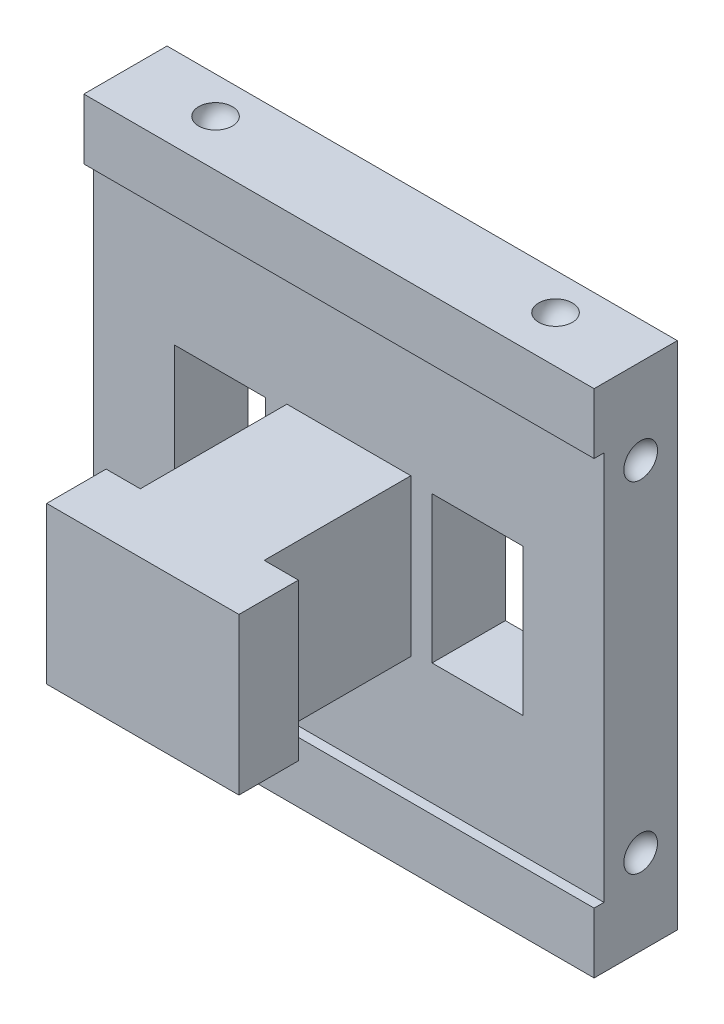
ISO-10303-21;
HEADER;
FILE_DESCRIPTION(('STEP AP214'),'2;1');
FILE_NAME('part.step','',(''),(''),'','','');
FILE_SCHEMA(('AUTOMOTIVE_DESIGN { 1 0 10303 214 1 1 1 1 }'));
ENDSEC;
DATA;
#1=APPLICATION_CONTEXT('core data for automotive mechanical design processes');
#2=APPLICATION_PROTOCOL_DEFINITION('international standard','automotive_design',2000,#1);
#3=PRODUCT_CONTEXT('',#1,'mechanical');
#4=PRODUCT('Part','Part','',(#3));
#5=PRODUCT_RELATED_PRODUCT_CATEGORY('part','',(#4));
#6=PRODUCT_DEFINITION_FORMATION('','',#4);
#7=PRODUCT_DEFINITION_CONTEXT('part definition',#1,'design');
#8=PRODUCT_DEFINITION('design','',#6,#7);
#9=PRODUCT_DEFINITION_SHAPE('','',#8);
#10=(LENGTH_UNIT() NAMED_UNIT(*) SI_UNIT(.MILLI.,.METRE.));
#11=(NAMED_UNIT(*) PLANE_ANGLE_UNIT() SI_UNIT($,.RADIAN.));
#12=(NAMED_UNIT(*) SI_UNIT($,.STERADIAN.) SOLID_ANGLE_UNIT());
#13=UNCERTAINTY_MEASURE_WITH_UNIT(LENGTH_MEASURE(1.E-05),#10,'distance_accuracy_value','');
#14=(GEOMETRIC_REPRESENTATION_CONTEXT(3) GLOBAL_UNCERTAINTY_ASSIGNED_CONTEXT((#13)) GLOBAL_UNIT_ASSIGNED_CONTEXT((#10,
#11,#12)) REPRESENTATION_CONTEXT('',''));
#15=CARTESIAN_POINT('',(0.,0.,0.));
#16=DIRECTION('',(0.,0.,1.));
#17=DIRECTION('',(1.,0.,0.));
#18=AXIS2_PLACEMENT_3D('',#15,#16,#17);
#19=CARTESIAN_POINT('',(0.,0.,3.7));
#20=DIRECTION('',(0.,0.,-1.));
#21=DIRECTION('',(-1.,0.,0.));
#22=AXIS2_PLACEMENT_3D('',#19,#20,#21);
#23=PLANE('',#22);
#24=DIRECTION('',(0.,-1.,0.));
#25=VECTOR('',#24,1.);
#26=CARTESIAN_POINT('',(17.075,15.525,3.7));
#27=LINE('',#26,#25);
#28=CARTESIAN_POINT('',(17.075,15.525,3.7));
#29=VERTEX_POINT('',#28);
#30=CARTESIAN_POINT('',(17.075,8.125,3.7));
#31=VERTEX_POINT('',#30);
#32=EDGE_CURVE('E380',#29,#31,#27,.T.);
#33=ORIENTED_EDGE('',*,*,#32,.F.);
#34=DIRECTION('',(-1.,0.,0.));
#35=VECTOR('',#34,1.);
#36=CARTESIAN_POINT('',(21.675,15.525,3.7));
#37=LINE('',#36,#35);
#38=CARTESIAN_POINT('',(21.675,15.525,3.7));
#39=VERTEX_POINT('',#38);
#40=EDGE_CURVE('E378',#39,#29,#37,.T.);
#41=ORIENTED_EDGE('',*,*,#40,.F.);
#42=DIRECTION('',(0.,1.,0.));
#43=VECTOR('',#42,1.);
#44=CARTESIAN_POINT('',(21.675,15.525,3.7));
#45=LINE('',#44,#43);
#46=CARTESIAN_POINT('',(21.675,8.125,3.7));
#47=VERTEX_POINT('',#46);
#48=EDGE_CURVE('E386',#47,#39,#45,.T.);
#49=ORIENTED_EDGE('',*,*,#48,.F.);
#50=DIRECTION('',(1.,0.,0.));
#51=VECTOR('',#50,1.);
#52=CARTESIAN_POINT('',(21.675,8.125,3.7));
#53=LINE('',#52,#51);
#54=EDGE_CURVE('E383',#31,#47,#53,.T.);
#55=ORIENTED_EDGE('',*,*,#54,.F.);
#56=EDGE_LOOP('',(#33,#41,#49,#55));
#57=FACE_BOUND('',#56,.T.);
#58=DIRECTION('',(1.,0.,0.));
#59=VECTOR('',#58,1.);
#60=CARTESIAN_POINT('',(4.08,8.125,3.7));
#61=LINE('',#60,#59);
#62=CARTESIAN_POINT('',(4.08,8.125,3.7));
#63=VERTEX_POINT('',#62);
#64=CARTESIAN_POINT('',(8.68,8.125,3.7));
#65=VERTEX_POINT('',#64);
#66=EDGE_CURVE('E348',#63,#65,#61,.T.);
#67=ORIENTED_EDGE('',*,*,#66,.F.);
#68=DIRECTION('',(0.,-1.,0.));
#69=VECTOR('',#68,1.);
#70=CARTESIAN_POINT('',(4.08,15.525,3.7));
#71=LINE('',#70,#69);
#72=CARTESIAN_POINT('',(4.08,15.525,3.7));
#73=VERTEX_POINT('',#72);
#74=EDGE_CURVE('E346',#73,#63,#71,.T.);
#75=ORIENTED_EDGE('',*,*,#74,.F.);
#76=DIRECTION('',(-1.,0.,0.));
#77=VECTOR('',#76,1.);
#78=CARTESIAN_POINT('',(4.08,15.525,3.7));
#79=LINE('',#78,#77);
#80=CARTESIAN_POINT('',(8.68,15.525,3.7));
#81=VERTEX_POINT('',#80);
#82=EDGE_CURVE('E354',#81,#73,#79,.T.);
#83=ORIENTED_EDGE('',*,*,#82,.F.);
#84=DIRECTION('',(0.,1.,0.));
#85=VECTOR('',#84,1.);
#86=CARTESIAN_POINT('',(8.68,15.525,3.7));
#87=LINE('',#86,#85);
#88=EDGE_CURVE('E351',#65,#81,#87,.T.);
#89=ORIENTED_EDGE('',*,*,#88,.F.);
#90=EDGE_LOOP('',(#67,#75,#83,#89));
#91=FACE_BOUND('',#90,.T.);
#92=DIRECTION('',(-1.,0.,0.));
#93=VECTOR('',#92,1.);
#94=CARTESIAN_POINT('',(9.75,15.775,3.7));
#95=LINE('',#94,#93);
#96=CARTESIAN_POINT('',(16.005,15.775,3.7));
#97=VERTEX_POINT('',#96);
#98=CARTESIAN_POINT('',(9.75,15.775,3.7));
#99=VERTEX_POINT('',#98);
#100=EDGE_CURVE('E315',#97,#99,#95,.T.);
#101=ORIENTED_EDGE('',*,*,#100,.F.);
#102=DIRECTION('',(0.,1.,0.));
#103=VECTOR('',#102,1.);
#104=CARTESIAN_POINT('',(16.005,15.775,3.7));
#105=LINE('',#104,#103);
#106=CARTESIAN_POINT('',(16.005,7.875,3.7));
#107=VERTEX_POINT('',#106);
#108=EDGE_CURVE('E321',#107,#97,#105,.T.);
#109=ORIENTED_EDGE('',*,*,#108,.F.);
#110=DIRECTION('',(1.,0.,0.));
#111=VECTOR('',#110,1.);
#112=CARTESIAN_POINT('',(9.75,7.875,3.7));
#113=LINE('',#112,#111);
#114=CARTESIAN_POINT('',(9.75,7.875,3.7));
#115=VERTEX_POINT('',#114);
#116=EDGE_CURVE('E328',#115,#107,#113,.T.);
#117=ORIENTED_EDGE('',*,*,#116,.F.);
#118=DIRECTION('',(0.,-1.,0.));
#119=VECTOR('',#118,1.);
#120=CARTESIAN_POINT('',(9.75,15.775,3.7));
#121=LINE('',#120,#119);
#122=EDGE_CURVE('E326',#99,#115,#121,.T.);
#123=ORIENTED_EDGE('',*,*,#122,.F.);
#124=EDGE_LOOP('',(#101,#109,#117,#123));
#125=FACE_BOUND('',#124,.T.);
#126=DIRECTION('',(-1.,0.,0.));
#127=VECTOR('',#126,1.);
#128=CARTESIAN_POINT('',(0.,2.,3.7));
#129=LINE('',#128,#127);
#130=CARTESIAN_POINT('',(25.755,2.,3.7));
#131=VERTEX_POINT('',#130);
#132=CARTESIAN_POINT('',(0.,2.,3.7));
#133=VERTEX_POINT('',#132);
#134=EDGE_CURVE('E224',#131,#133,#129,.T.);
#135=ORIENTED_EDGE('',*,*,#134,.F.);
#136=DIRECTION('',(0.,1.,0.));
#137=VECTOR('',#136,1.);
#138=CARTESIAN_POINT('',(25.755,0.,3.7));
#139=LINE('',#138,#137);
#140=CARTESIAN_POINT('',(25.755,21.65,3.7));
#141=VERTEX_POINT('',#140);
#142=EDGE_CURVE('E11',#131,#141,#139,.T.);
#143=ORIENTED_EDGE('',*,*,#142,.T.);
#144=DIRECTION('',(1.,0.,0.));
#145=VECTOR('',#144,1.);
#146=CARTESIAN_POINT('',(0.,21.65,3.7));
#147=LINE('',#146,#145);
#148=CARTESIAN_POINT('',(0.,21.65,3.7));
#149=VERTEX_POINT('',#148);
#150=EDGE_CURVE('E234',#149,#141,#147,.T.);
#151=ORIENTED_EDGE('',*,*,#150,.F.);
#152=DIRECTION('',(0.,-1.,0.));
#153=VECTOR('',#152,1.);
#154=CARTESIAN_POINT('',(0.,0.,3.7));
#155=LINE('',#154,#153);
#156=EDGE_CURVE('E43',#149,#133,#155,.T.);
#157=ORIENTED_EDGE('',*,*,#156,.T.);
#158=EDGE_LOOP('',(#135,#143,#151,#157));
#159=FACE_BOUND('',#158,.T.);
#160=ADVANCED_FACE('F34',(#57,#91,#125,#159),#23,.F.);
#161=CARTESIAN_POINT('',(16.005,15.775,14.1));
#162=DIRECTION('',(-1.,0.,0.));
#163=DIRECTION('',(0.,0.,1.));
#164=AXIS2_PLACEMENT_3D('',#161,#162,#163);
#165=PLANE('',#164);
#166=DIRECTION('',(0.,-1.,0.));
#167=VECTOR('',#166,1.);
#168=CARTESIAN_POINT('',(16.005,15.775,11.1));
#169=LINE('',#168,#167);
#170=CARTESIAN_POINT('',(16.005,15.775,11.1));
#171=VERTEX_POINT('',#170);
#172=CARTESIAN_POINT('',(16.005,7.875,11.1));
#173=VERTEX_POINT('',#172);
#174=EDGE_CURVE('E278',#171,#173,#169,.T.);
#175=ORIENTED_EDGE('',*,*,#174,.T.);
#176=DIRECTION('',(0.,0.,-1.));
#177=VECTOR('',#176,1.);
#178=CARTESIAN_POINT('',(16.005,7.875,14.1));
#179=LINE('',#178,#177);
#180=EDGE_CURVE('E333',#173,#107,#179,.T.);
#181=ORIENTED_EDGE('',*,*,#180,.T.);
#182=ORIENTED_EDGE('',*,*,#108,.T.);
#183=DIRECTION('',(0.,0.,-1.));
#184=VECTOR('',#183,1.);
#185=CARTESIAN_POINT('',(16.005,15.775,14.1));
#186=LINE('',#185,#184);
#187=EDGE_CURVE('E323',#171,#97,#186,.T.);
#188=ORIENTED_EDGE('',*,*,#187,.F.);
#189=EDGE_LOOP('',(#175,#181,#182,#188));
#190=FACE_BOUND('',#189,.T.);
#191=ADVANCED_FACE('F449',(#190),#165,.F.);
#192=CARTESIAN_POINT('',(9.75,15.775,14.1));
#193=DIRECTION('',(1.,0.,0.));
#194=DIRECTION('',(0.,0.,-1.));
#195=AXIS2_PLACEMENT_3D('',#192,#193,#194);
#196=PLANE('',#195);
#197=DIRECTION('',(0.,1.,0.));
#198=VECTOR('',#197,1.);
#199=CARTESIAN_POINT('',(9.75,15.775,11.1));
#200=LINE('',#199,#198);
#201=CARTESIAN_POINT('',(9.75,7.875,11.1));
#202=VERTEX_POINT('',#201);
#203=CARTESIAN_POINT('',(9.75,15.775,11.1));
#204=VERTEX_POINT('',#203);
#205=EDGE_CURVE('E307',#202,#204,#200,.T.);
#206=ORIENTED_EDGE('',*,*,#205,.T.);
#207=DIRECTION('',(0.,0.,-1.));
#208=VECTOR('',#207,1.);
#209=CARTESIAN_POINT('',(9.75,15.775,14.1));
#210=LINE('',#209,#208);
#211=EDGE_CURVE('E50',#204,#99,#210,.T.);
#212=ORIENTED_EDGE('',*,*,#211,.T.);
#213=ORIENTED_EDGE('',*,*,#122,.T.);
#214=DIRECTION('',(0.,0.,-1.));
#215=VECTOR('',#214,1.);
#216=CARTESIAN_POINT('',(9.75,7.875,14.1));
#217=LINE('',#216,#215);
#218=EDGE_CURVE('E58',#202,#115,#217,.T.);
#219=ORIENTED_EDGE('',*,*,#218,.F.);
#220=EDGE_LOOP('',(#206,#212,#213,#219));
#221=FACE_BOUND('',#220,.T.);
#222=ADVANCED_FACE('F455',(#221),#196,.F.);
#223=CARTESIAN_POINT('',(0.,0.,3.7));
#224=DIRECTION('',(1.,0.,0.));
#225=DIRECTION('',(0.,0.,-1.));
#226=AXIS2_PLACEMENT_3D('',#223,#224,#225);
#227=PLANE('',#226);
#228=CARTESIAN_POINT('',(0.,3.245,1.85));
#229=DIRECTION('',(-1.,0.,0.));
#230=DIRECTION('',(0.,0.,-1.));
#231=AXIS2_PLACEMENT_3D('',#228,#229,#230);
#232=CIRCLE('',#231,0.85);
#233=CARTESIAN_POINT('',(0.,3.245,1.));
#234=VERTEX_POINT('',#233);
#235=EDGE_CURVE('E254',#234,#234,#232,.T.);
#236=ORIENTED_EDGE('',*,*,#235,.F.);
#237=EDGE_LOOP('',(#236));
#238=FACE_BOUND('',#237,.T.);
#239=CARTESIAN_POINT('',(0.,20.405,1.85));
#240=DIRECTION('',(-1.,0.,0.));
#241=DIRECTION('',(0.,0.,1.));
#242=AXIS2_PLACEMENT_3D('',#239,#240,#241);
#243=CIRCLE('',#242,0.85);
#244=CARTESIAN_POINT('',(0.,20.405,2.7));
#245=VERTEX_POINT('',#244);
#246=EDGE_CURVE('E257',#245,#245,#243,.T.);
#247=ORIENTED_EDGE('',*,*,#246,.F.);
#248=EDGE_LOOP('',(#247));
#249=FACE_BOUND('',#248,.T.);
#250=ORIENTED_EDGE('',*,*,#156,.F.);
#251=DIRECTION('',(0.,0.,-1.));
#252=VECTOR('',#251,1.);
#253=CARTESIAN_POINT('',(0.,21.65,4.2));
#254=LINE('',#253,#252);
#255=CARTESIAN_POINT('',(0.,21.65,4.2));
#256=VERTEX_POINT('',#255);
#257=EDGE_CURVE('E251',#256,#149,#254,.T.);
#258=ORIENTED_EDGE('',*,*,#257,.F.);
#259=DIRECTION('',(0.,-1.,0.));
#260=VECTOR('',#259,1.);
#261=CARTESIAN_POINT('',(0.,24.705,4.2));
#262=LINE('',#261,#260);
#263=CARTESIAN_POINT('',(0.,24.705,4.2));
#264=VERTEX_POINT('',#263);
#265=EDGE_CURVE('E235',#264,#256,#262,.T.);
#266=ORIENTED_EDGE('',*,*,#265,.F.);
#267=DIRECTION('',(0.,0.,-1.));
#268=VECTOR('',#267,1.);
#269=CARTESIAN_POINT('',(0.,24.705,3.7));
#270=LINE('',#269,#268);
#271=CARTESIAN_POINT('',(0.,24.705,0.));
#272=VERTEX_POINT('',#271);
#273=EDGE_CURVE('E270',#264,#272,#270,.T.);
#274=ORIENTED_EDGE('',*,*,#273,.T.);
#275=DIRECTION('',(0.,-1.,0.));
#276=VECTOR('',#275,1.);
#277=CARTESIAN_POINT('',(0.,0.,0.));
#278=LINE('',#277,#276);
#279=CARTESIAN_POINT('',(0.,-1.055,0.));
#280=VERTEX_POINT('',#279);
#281=EDGE_CURVE('E205',#272,#280,#278,.T.);
#282=ORIENTED_EDGE('',*,*,#281,.T.);
#283=DIRECTION('',(0.,0.,-1.));
#284=VECTOR('',#283,1.);
#285=CARTESIAN_POINT('',(0.,-1.055,3.7));
#286=LINE('',#285,#284);
#287=CARTESIAN_POINT('',(0.,-1.055,4.2));
#288=VERTEX_POINT('',#287);
#289=EDGE_CURVE('E198',#288,#280,#286,.T.);
#290=ORIENTED_EDGE('',*,*,#289,.F.);
#291=DIRECTION('',(0.,-1.,0.));
#292=VECTOR('',#291,1.);
#293=CARTESIAN_POINT('',(0.,-1.055,4.2));
#294=LINE('',#293,#292);
#295=CARTESIAN_POINT('',(0.,2.,4.2));
#296=VERTEX_POINT('',#295);
#297=EDGE_CURVE('E203',#296,#288,#294,.T.);
#298=ORIENTED_EDGE('',*,*,#297,.F.);
#299=DIRECTION('',(0.,0.,-1.));
#300=VECTOR('',#299,1.);
#301=CARTESIAN_POINT('',(0.,2.,4.2));
#302=LINE('',#301,#300);
#303=EDGE_CURVE('E229',#296,#133,#302,.T.);
#304=ORIENTED_EDGE('',*,*,#303,.T.);
#305=EDGE_LOOP('',(#250,#258,#266,#274,#282,#290,#298,#304));
#306=FACE_BOUND('',#305,.T.);
#307=ADVANCED_FACE('F36',(#238,#249,#306),#227,.F.);
#308=CARTESIAN_POINT('',(25.755,0.,3.7));
#309=DIRECTION('',(-1.,0.,0.));
#310=DIRECTION('',(0.,0.,1.));
#311=AXIS2_PLACEMENT_3D('',#308,#309,#310);
#312=PLANE('',#311);
#313=CARTESIAN_POINT('',(25.755,3.245,1.85));
#314=DIRECTION('',(-1.,0.,0.));
#315=DIRECTION('',(0.,0.,-1.));
#316=AXIS2_PLACEMENT_3D('',#313,#314,#315);
#317=CIRCLE('',#316,0.85);
#318=CARTESIAN_POINT('',(25.755,3.245,1.));
#319=VERTEX_POINT('',#318);
#320=EDGE_CURVE('E261',#319,#319,#317,.T.);
#321=ORIENTED_EDGE('',*,*,#320,.T.);
#322=EDGE_LOOP('',(#321));
#323=FACE_BOUND('',#322,.T.);
#324=CARTESIAN_POINT('',(25.755,20.405,1.85));
#325=DIRECTION('',(-1.,0.,0.));
#326=DIRECTION('',(0.,0.,1.));
#327=AXIS2_PLACEMENT_3D('',#324,#325,#326);
#328=CIRCLE('',#327,0.85);
#329=CARTESIAN_POINT('',(25.755,20.405,2.7));
#330=VERTEX_POINT('',#329);
#331=EDGE_CURVE('E264',#330,#330,#328,.T.);
#332=ORIENTED_EDGE('',*,*,#331,.T.);
#333=EDGE_LOOP('',(#332));
#334=FACE_BOUND('',#333,.T.);
#335=DIRECTION('',(0.,1.,0.));
#336=VECTOR('',#335,1.);
#337=CARTESIAN_POINT('',(25.755,0.,0.));
#338=LINE('',#337,#336);
#339=CARTESIAN_POINT('',(25.755,-1.055,0.));
#340=VERTEX_POINT('',#339);
#341=CARTESIAN_POINT('',(25.755,24.705,0.));
#342=VERTEX_POINT('',#341);
#343=EDGE_CURVE('E406',#340,#342,#338,.T.);
#344=ORIENTED_EDGE('',*,*,#343,.T.);
#345=DIRECTION('',(0.,0.,-1.));
#346=VECTOR('',#345,1.);
#347=CARTESIAN_POINT('',(25.755,24.705,3.7));
#348=LINE('',#347,#346);
#349=CARTESIAN_POINT('',(25.755,24.705,4.2));
#350=VERTEX_POINT('',#349);
#351=EDGE_CURVE('E271',#350,#342,#348,.T.);
#352=ORIENTED_EDGE('',*,*,#351,.F.);
#353=DIRECTION('',(0.,1.,0.));
#354=VECTOR('',#353,1.);
#355=CARTESIAN_POINT('',(25.755,24.705,4.2));
#356=LINE('',#355,#354);
#357=CARTESIAN_POINT('',(25.755,21.65,4.2));
#358=VERTEX_POINT('',#357);
#359=EDGE_CURVE('E240',#358,#350,#356,.T.);
#360=ORIENTED_EDGE('',*,*,#359,.F.);
#361=DIRECTION('',(0.,0.,-1.));
#362=VECTOR('',#361,1.);
#363=CARTESIAN_POINT('',(25.755,21.65,4.2));
#364=LINE('',#363,#362);
#365=EDGE_CURVE('E246',#358,#141,#364,.T.);
#366=ORIENTED_EDGE('',*,*,#365,.T.);
#367=ORIENTED_EDGE('',*,*,#142,.F.);
#368=DIRECTION('',(0.,0.,-1.));
#369=VECTOR('',#368,1.);
#370=CARTESIAN_POINT('',(25.755,2.,4.2));
#371=LINE('',#370,#369);
#372=CARTESIAN_POINT('',(25.755,2.,4.2));
#373=VERTEX_POINT('',#372);
#374=EDGE_CURVE('E232',#373,#131,#371,.T.);
#375=ORIENTED_EDGE('',*,*,#374,.F.);
#376=DIRECTION('',(0.,1.,0.));
#377=VECTOR('',#376,1.);
#378=CARTESIAN_POINT('',(25.755,-1.055,4.2));
#379=LINE('',#378,#377);
#380=CARTESIAN_POINT('',(25.755,-1.055,4.2));
#381=VERTEX_POINT('',#380);
#382=EDGE_CURVE('E218',#381,#373,#379,.T.);
#383=ORIENTED_EDGE('',*,*,#382,.F.);
#384=DIRECTION('',(0.,0.,-1.));
#385=VECTOR('',#384,1.);
#386=CARTESIAN_POINT('',(25.755,-1.055,3.7));
#387=LINE('',#386,#385);
#388=EDGE_CURVE('E210',#381,#340,#387,.T.);
#389=ORIENTED_EDGE('',*,*,#388,.T.);
#390=EDGE_LOOP('',(#344,#352,#360,#366,#367,#375,#383,#389));
#391=FACE_BOUND('',#390,.T.);
#392=ADVANCED_FACE('F418',(#323,#334,#391),#312,.F.);
#393=CARTESIAN_POINT('',(0.,0.,0.));
#394=DIRECTION('',(0.,0.,-1.));
#395=DIRECTION('',(-1.,0.,0.));
#396=AXIS2_PLACEMENT_3D('',#393,#394,#395);
#397=PLANE('',#396);
#398=DIRECTION('',(0.,-1.,0.));
#399=VECTOR('',#398,1.);
#400=CARTESIAN_POINT('',(4.08,15.525,0.));
#401=LINE('',#400,#399);
#402=CARTESIAN_POINT('',(4.08,15.525,0.));
#403=VERTEX_POINT('',#402);
#404=CARTESIAN_POINT('',(4.08,8.125,0.));
#405=VERTEX_POINT('',#404);
#406=EDGE_CURVE('E343',#403,#405,#401,.T.);
#407=ORIENTED_EDGE('',*,*,#406,.T.);
#408=DIRECTION('',(1.,0.,0.));
#409=VECTOR('',#408,1.);
#410=CARTESIAN_POINT('',(4.08,8.125,0.));
#411=LINE('',#410,#409);
#412=CARTESIAN_POINT('',(8.68,8.125,0.));
#413=VERTEX_POINT('',#412);
#414=EDGE_CURVE('E360',#405,#413,#411,.T.);
#415=ORIENTED_EDGE('',*,*,#414,.T.);
#416=DIRECTION('',(0.,1.,0.));
#417=VECTOR('',#416,1.);
#418=CARTESIAN_POINT('',(8.68,15.525,0.));
#419=LINE('',#418,#417);
#420=CARTESIAN_POINT('',(8.68,15.525,0.));
#421=VERTEX_POINT('',#420);
#422=EDGE_CURVE('E337',#413,#421,#419,.T.);
#423=ORIENTED_EDGE('',*,*,#422,.T.);
#424=DIRECTION('',(-1.,0.,0.));
#425=VECTOR('',#424,1.);
#426=CARTESIAN_POINT('',(4.08,15.525,0.));
#427=LINE('',#426,#425);
#428=EDGE_CURVE('E340',#421,#403,#427,.T.);
#429=ORIENTED_EDGE('',*,*,#428,.T.);
#430=EDGE_LOOP('',(#407,#415,#423,#429));
#431=FACE_BOUND('',#430,.T.);
#432=DIRECTION('',(-1.,0.,0.));
#433=VECTOR('',#432,1.);
#434=CARTESIAN_POINT('',(21.675,15.525,0.));
#435=LINE('',#434,#433);
#436=CARTESIAN_POINT('',(21.675,15.525,0.));
#437=VERTEX_POINT('',#436);
#438=CARTESIAN_POINT('',(17.075,15.525,0.));
#439=VERTEX_POINT('',#438);
#440=EDGE_CURVE('E375',#437,#439,#435,.T.);
#441=ORIENTED_EDGE('',*,*,#440,.T.);
#442=DIRECTION('',(0.,-1.,0.));
#443=VECTOR('',#442,1.);
#444=CARTESIAN_POINT('',(17.075,15.525,0.));
#445=LINE('',#444,#443);
#446=CARTESIAN_POINT('',(17.075,8.125,0.));
#447=VERTEX_POINT('',#446);
#448=EDGE_CURVE('E392',#439,#447,#445,.T.);
#449=ORIENTED_EDGE('',*,*,#448,.T.);
#450=DIRECTION('',(1.,0.,0.));
#451=VECTOR('',#450,1.);
#452=CARTESIAN_POINT('',(21.675,8.125,0.));
#453=LINE('',#452,#451);
#454=CARTESIAN_POINT('',(21.675,8.125,0.));
#455=VERTEX_POINT('',#454);
#456=EDGE_CURVE('E369',#447,#455,#453,.T.);
#457=ORIENTED_EDGE('',*,*,#456,.T.);
#458=DIRECTION('',(0.,1.,0.));
#459=VECTOR('',#458,1.);
#460=CARTESIAN_POINT('',(21.675,15.525,0.));
#461=LINE('',#460,#459);
#462=EDGE_CURVE('E372',#455,#437,#461,.T.);
#463=ORIENTED_EDGE('',*,*,#462,.T.);
#464=EDGE_LOOP('',(#441,#449,#457,#463));
#465=FACE_BOUND('',#464,.T.);
#466=ORIENTED_EDGE('',*,*,#281,.F.);
#467=DIRECTION('',(1.,0.,0.));
#468=VECTOR('',#467,1.);
#469=CARTESIAN_POINT('',(0.,24.705,0.));
#470=LINE('',#469,#468);
#471=EDGE_CURVE('E267',#272,#342,#470,.T.);
#472=ORIENTED_EDGE('',*,*,#471,.T.);
#473=ORIENTED_EDGE('',*,*,#343,.F.);
#474=DIRECTION('',(-1.,0.,0.));
#475=VECTOR('',#474,1.);
#476=CARTESIAN_POINT('',(25.755,-1.055,0.));
#477=LINE('',#476,#475);
#478=EDGE_CURVE('E274',#340,#280,#477,.T.);
#479=ORIENTED_EDGE('',*,*,#478,.T.);
#480=EDGE_LOOP('',(#466,#472,#473,#479));
#481=FACE_BOUND('',#480,.T.);
#482=ADVANCED_FACE('F425',(#431,#465,#481),#397,.T.);
#483=CARTESIAN_POINT('',(21.675,15.525,-0.00100000000000013));
#484=DIRECTION('',(0.,1.,0.));
#485=DIRECTION('',(0.,0.,1.));
#486=AXIS2_PLACEMENT_3D('',#483,#484,#485);
#487=PLANE('',#486);
#488=DIRECTION('',(0.,0.,1.));
#489=VECTOR('',#488,1.);
#490=CARTESIAN_POINT('',(21.675,15.525,-0.00100000000000013));
#491=LINE('',#490,#489);
#492=EDGE_CURVE('E390',#437,#39,#491,.T.);
#493=ORIENTED_EDGE('',*,*,#492,.T.);
#494=ORIENTED_EDGE('',*,*,#40,.T.);
#495=DIRECTION('',(0.,0.,1.));
#496=VECTOR('',#495,1.);
#497=CARTESIAN_POINT('',(17.075,15.525,-0.00100000000000013));
#498=LINE('',#497,#496);
#499=EDGE_CURVE('E389',#439,#29,#498,.T.);
#500=ORIENTED_EDGE('',*,*,#499,.F.);
#501=ORIENTED_EDGE('',*,*,#440,.F.);
#502=EDGE_LOOP('',(#493,#494,#500,#501));
#503=FACE_BOUND('',#502,.T.);
#504=ADVANCED_FACE('F462',(#503),#487,.F.);
#505=CARTESIAN_POINT('',(21.675,15.525,-0.00100000000000013));
#506=DIRECTION('',(1.,0.,0.));
#507=DIRECTION('',(0.,1.,0.));
#508=AXIS2_PLACEMENT_3D('',#505,#506,#507);
#509=PLANE('',#508);
#510=DIRECTION('',(0.,0.,1.));
#511=VECTOR('',#510,1.);
#512=CARTESIAN_POINT('',(21.675,8.125,-0.00100000000000013));
#513=LINE('',#512,#511);
#514=EDGE_CURVE('E393',#455,#47,#513,.T.);
#515=ORIENTED_EDGE('',*,*,#514,.T.);
#516=ORIENTED_EDGE('',*,*,#48,.T.);
#517=ORIENTED_EDGE('',*,*,#492,.F.);
#518=ORIENTED_EDGE('',*,*,#462,.F.);
#519=EDGE_LOOP('',(#515,#516,#517,#518));
#520=FACE_BOUND('',#519,.T.);
#521=ADVANCED_FACE('F540',(#520),#509,.F.);
#522=CARTESIAN_POINT('',(21.675,8.125,-0.00100000000000013));
#523=DIRECTION('',(0.,-1.,0.));
#524=DIRECTION('',(0.,0.,-1.));
#525=AXIS2_PLACEMENT_3D('',#522,#523,#524);
#526=PLANE('',#525);
#527=DIRECTION('',(0.,0.,1.));
#528=VECTOR('',#527,1.);
#529=CARTESIAN_POINT('',(17.075,8.125,-0.00100000000000013));
#530=LINE('',#529,#528);
#531=EDGE_CURVE('E395',#447,#31,#530,.T.);
#532=ORIENTED_EDGE('',*,*,#531,.T.);
#533=ORIENTED_EDGE('',*,*,#54,.T.);
#534=ORIENTED_EDGE('',*,*,#514,.F.);
#535=ORIENTED_EDGE('',*,*,#456,.F.);
#536=EDGE_LOOP('',(#532,#533,#534,#535));
#537=FACE_BOUND('',#536,.T.);
#538=ADVANCED_FACE('F543',(#537),#526,.F.);
#539=CARTESIAN_POINT('',(17.075,15.525,-0.00100000000000013));
#540=DIRECTION('',(-1.,0.,0.));
#541=DIRECTION('',(0.,0.,1.));
#542=AXIS2_PLACEMENT_3D('',#539,#540,#541);
#543=PLANE('',#542);
#544=ORIENTED_EDGE('',*,*,#499,.T.);
#545=ORIENTED_EDGE('',*,*,#32,.T.);
#546=ORIENTED_EDGE('',*,*,#531,.F.);
#547=ORIENTED_EDGE('',*,*,#448,.F.);
#548=EDGE_LOOP('',(#544,#545,#546,#547));
#549=FACE_BOUND('',#548,.T.);
#550=ADVANCED_FACE('F538',(#549),#543,.F.);
#551=CARTESIAN_POINT('',(4.08,15.525,-0.00100000000000013));
#552=DIRECTION('',(-1.,0.,0.));
#553=DIRECTION('',(0.,0.,1.));
#554=AXIS2_PLACEMENT_3D('',#551,#552,#553);
#555=PLANE('',#554);
#556=DIRECTION('',(0.,0.,1.));
#557=VECTOR('',#556,1.);
#558=CARTESIAN_POINT('',(4.08,15.525,-0.00100000000000013));
#559=LINE('',#558,#557);
#560=EDGE_CURVE('E358',#403,#73,#559,.T.);
#561=ORIENTED_EDGE('',*,*,#560,.T.);
#562=ORIENTED_EDGE('',*,*,#74,.T.);
#563=DIRECTION('',(0.,0.,1.));
#564=VECTOR('',#563,1.);
#565=CARTESIAN_POINT('',(4.08,8.125,-0.00100000000000013));
#566=LINE('',#565,#564);
#567=EDGE_CURVE('E357',#405,#63,#566,.T.);
#568=ORIENTED_EDGE('',*,*,#567,.F.);
#569=ORIENTED_EDGE('',*,*,#406,.F.);
#570=EDGE_LOOP('',(#561,#562,#568,#569));
#571=FACE_BOUND('',#570,.T.);
#572=ADVANCED_FACE('F528',(#571),#555,.F.);
#573=CARTESIAN_POINT('',(4.08,15.525,-0.00100000000000013));
#574=DIRECTION('',(0.,1.,0.));
#575=DIRECTION('',(0.,0.,1.));
#576=AXIS2_PLACEMENT_3D('',#573,#574,#575);
#577=PLANE('',#576);
#578=DIRECTION('',(0.,0.,1.));
#579=VECTOR('',#578,1.);
#580=CARTESIAN_POINT('',(8.68,15.525,-0.00100000000000013));
#581=LINE('',#580,#579);
#582=EDGE_CURVE('E361',#421,#81,#581,.T.);
#583=ORIENTED_EDGE('',*,*,#582,.T.);
#584=ORIENTED_EDGE('',*,*,#82,.T.);
#585=ORIENTED_EDGE('',*,*,#560,.F.);
#586=ORIENTED_EDGE('',*,*,#428,.F.);
#587=EDGE_LOOP('',(#583,#584,#585,#586));
#588=FACE_BOUND('',#587,.T.);
#589=ADVANCED_FACE('F524',(#588),#577,.F.);
#590=CARTESIAN_POINT('',(8.68,15.525,-0.00100000000000013));
#591=DIRECTION('',(1.,0.,0.));
#592=DIRECTION('',(0.,1.,0.));
#593=AXIS2_PLACEMENT_3D('',#590,#591,#592);
#594=PLANE('',#593);
#595=DIRECTION('',(0.,0.,1.));
#596=VECTOR('',#595,1.);
#597=CARTESIAN_POINT('',(8.68,8.125,-0.00100000000000013));
#598=LINE('',#597,#596);
#599=EDGE_CURVE('E363',#413,#65,#598,.T.);
#600=ORIENTED_EDGE('',*,*,#599,.T.);
#601=ORIENTED_EDGE('',*,*,#88,.T.);
#602=ORIENTED_EDGE('',*,*,#582,.F.);
#603=ORIENTED_EDGE('',*,*,#422,.F.);
#604=EDGE_LOOP('',(#600,#601,#602,#603));
#605=FACE_BOUND('',#604,.T.);
#606=ADVANCED_FACE('F527',(#605),#594,.F.);
#607=CARTESIAN_POINT('',(4.08,8.125,-0.00100000000000013));
#608=DIRECTION('',(0.,-1.,0.));
#609=DIRECTION('',(0.,0.,-1.));
#610=AXIS2_PLACEMENT_3D('',#607,#608,#609);
#611=PLANE('',#610);
#612=ORIENTED_EDGE('',*,*,#567,.T.);
#613=ORIENTED_EDGE('',*,*,#66,.T.);
#614=ORIENTED_EDGE('',*,*,#599,.F.);
#615=ORIENTED_EDGE('',*,*,#414,.F.);
#616=EDGE_LOOP('',(#612,#613,#614,#615));
#617=FACE_BOUND('',#616,.T.);
#618=ADVANCED_FACE('F522',(#617),#611,.F.);
#619=CARTESIAN_POINT('',(9.75,15.775,14.1));
#620=DIRECTION('',(0.,-1.,0.));
#621=DIRECTION('',(0.,0.,-1.));
#622=AXIS2_PLACEMENT_3D('',#619,#620,#621);
#623=PLANE('',#622);
#624=ORIENTED_EDGE('',*,*,#100,.T.);
#625=ORIENTED_EDGE('',*,*,#211,.F.);
#626=DIRECTION('',(-1.,0.,0.));
#627=VECTOR('',#626,1.);
#628=CARTESIAN_POINT('',(9.75,15.775,11.1));
#629=LINE('',#628,#627);
#630=CARTESIAN_POINT('',(8.025,15.775,11.1));
#631=VERTEX_POINT('',#630);
#632=EDGE_CURVE('E299',#204,#631,#629,.T.);
#633=ORIENTED_EDGE('',*,*,#632,.T.);
#634=DIRECTION('',(0.,0.,1.));
#635=VECTOR('',#634,1.);
#636=CARTESIAN_POINT('',(8.025,15.775,11.1));
#637=LINE('',#636,#635);
#638=CARTESIAN_POINT('',(8.025,15.775,14.1));
#639=VERTEX_POINT('',#638);
#640=EDGE_CURVE('E309',#631,#639,#637,.T.);
#641=ORIENTED_EDGE('',*,*,#640,.T.);
#642=DIRECTION('',(-1.,0.,0.));
#643=VECTOR('',#642,1.);
#644=CARTESIAN_POINT('',(9.75,15.775,14.1));
#645=LINE('',#644,#643);
#646=CARTESIAN_POINT('',(17.73,15.775,14.1));
#647=VERTEX_POINT('',#646);
#648=EDGE_CURVE('E318',#647,#639,#645,.T.);
#649=ORIENTED_EDGE('',*,*,#648,.F.);
#650=DIRECTION('',(0.,0.,1.));
#651=VECTOR('',#650,1.);
#652=CARTESIAN_POINT('',(17.73,15.775,11.1));
#653=LINE('',#652,#651);
#654=CARTESIAN_POINT('',(17.73,15.775,11.1));
#655=VERTEX_POINT('',#654);
#656=EDGE_CURVE('E293',#655,#647,#653,.T.);
#657=ORIENTED_EDGE('',*,*,#656,.F.);
#658=DIRECTION('',(-1.,0.,0.));
#659=VECTOR('',#658,1.);
#660=CARTESIAN_POINT('',(16.005,15.775,11.1));
#661=LINE('',#660,#659);
#662=EDGE_CURVE('E287',#655,#171,#661,.T.);
#663=ORIENTED_EDGE('',*,*,#662,.T.);
#664=ORIENTED_EDGE('',*,*,#187,.T.);
#665=EDGE_LOOP('',(#624,#625,#633,#641,#649,#657,#663,#664));
#666=FACE_BOUND('',#665,.T.);
#667=ADVANCED_FACE('F517',(#666),#623,.F.);
#668=CARTESIAN_POINT('',(9.75,7.875,14.1));
#669=DIRECTION('',(0.,1.,0.));
#670=DIRECTION('',(0.,0.,1.));
#671=AXIS2_PLACEMENT_3D('',#668,#669,#670);
#672=PLANE('',#671);
#673=ORIENTED_EDGE('',*,*,#116,.T.);
#674=ORIENTED_EDGE('',*,*,#180,.F.);
#675=DIRECTION('',(1.,0.,0.));
#676=VECTOR('',#675,1.);
#677=CARTESIAN_POINT('',(16.005,7.875,11.1));
#678=LINE('',#677,#676);
#679=CARTESIAN_POINT('',(17.73,7.875,11.1));
#680=VERTEX_POINT('',#679);
#681=EDGE_CURVE('E281',#173,#680,#678,.T.);
#682=ORIENTED_EDGE('',*,*,#681,.T.);
#683=DIRECTION('',(0.,0.,1.));
#684=VECTOR('',#683,1.);
#685=CARTESIAN_POINT('',(17.73,7.875,11.1));
#686=LINE('',#685,#684);
#687=CARTESIAN_POINT('',(17.73,7.875,14.1));
#688=VERTEX_POINT('',#687);
#689=EDGE_CURVE('E290',#680,#688,#686,.T.);
#690=ORIENTED_EDGE('',*,*,#689,.T.);
#691=DIRECTION('',(1.,0.,0.));
#692=VECTOR('',#691,1.);
#693=CARTESIAN_POINT('',(9.75,7.875,14.1));
#694=LINE('',#693,#692);
#695=CARTESIAN_POINT('',(8.025,7.875,14.1));
#696=VERTEX_POINT('',#695);
#697=EDGE_CURVE('E320',#696,#688,#694,.T.);
#698=ORIENTED_EDGE('',*,*,#697,.F.);
#699=DIRECTION('',(0.,0.,1.));
#700=VECTOR('',#699,1.);
#701=CARTESIAN_POINT('',(8.025,7.875,11.1));
#702=LINE('',#701,#700);
#703=CARTESIAN_POINT('',(8.025,7.875,11.1));
#704=VERTEX_POINT('',#703);
#705=EDGE_CURVE('E312',#704,#696,#702,.T.);
#706=ORIENTED_EDGE('',*,*,#705,.F.);
#707=DIRECTION('',(1.,0.,0.));
#708=VECTOR('',#707,1.);
#709=CARTESIAN_POINT('',(9.75,7.875,11.1));
#710=LINE('',#709,#708);
#711=EDGE_CURVE('E305',#704,#202,#710,.T.);
#712=ORIENTED_EDGE('',*,*,#711,.T.);
#713=ORIENTED_EDGE('',*,*,#218,.T.);
#714=EDGE_LOOP('',(#673,#674,#682,#690,#698,#706,#712,#713));
#715=FACE_BOUND('',#714,.T.);
#716=ADVANCED_FACE('F512',(#715),#672,.F.);
#717=CARTESIAN_POINT('',(0.,0.,14.1));
#718=DIRECTION('',(0.,0.,-1.));
#719=DIRECTION('',(-1.,0.,0.));
#720=AXIS2_PLACEMENT_3D('',#717,#718,#719);
#721=PLANE('',#720);
#722=ORIENTED_EDGE('',*,*,#648,.T.);
#723=DIRECTION('',(0.,-1.,0.));
#724=VECTOR('',#723,1.);
#725=CARTESIAN_POINT('',(8.025,15.775,14.1));
#726=LINE('',#725,#724);
#727=EDGE_CURVE('E296',#639,#696,#726,.T.);
#728=ORIENTED_EDGE('',*,*,#727,.T.);
#729=ORIENTED_EDGE('',*,*,#697,.T.);
#730=DIRECTION('',(0.,1.,0.));
#731=VECTOR('',#730,1.);
#732=CARTESIAN_POINT('',(17.73,15.775,14.1));
#733=LINE('',#732,#731);
#734=EDGE_CURVE('E209',#688,#647,#733,.T.);
#735=ORIENTED_EDGE('',*,*,#734,.T.);
#736=EDGE_LOOP('',(#722,#728,#729,#735));
#737=FACE_BOUND('',#736,.T.);
#738=ADVANCED_FACE('F509',(#737),#721,.F.);
#739=CARTESIAN_POINT('',(8.025,15.775,11.1));
#740=DIRECTION('',(-1.,0.,0.));
#741=DIRECTION('',(0.,0.,1.));
#742=AXIS2_PLACEMENT_3D('',#739,#740,#741);
#743=PLANE('',#742);
#744=ORIENTED_EDGE('',*,*,#727,.F.);
#745=ORIENTED_EDGE('',*,*,#640,.F.);
#746=DIRECTION('',(0.,-1.,0.));
#747=VECTOR('',#746,1.);
#748=CARTESIAN_POINT('',(8.025,15.775,11.1));
#749=LINE('',#748,#747);
#750=EDGE_CURVE('E302',#631,#704,#749,.T.);
#751=ORIENTED_EDGE('',*,*,#750,.T.);
#752=ORIENTED_EDGE('',*,*,#705,.T.);
#753=EDGE_LOOP('',(#744,#745,#751,#752));
#754=FACE_BOUND('',#753,.T.);
#755=ADVANCED_FACE('F505',(#754),#743,.T.);
#756=CARTESIAN_POINT('',(0.,0.,11.1));
#757=DIRECTION('',(0.,0.,1.));
#758=DIRECTION('',(1.,0.,0.));
#759=AXIS2_PLACEMENT_3D('',#756,#757,#758);
#760=PLANE('',#759);
#761=ORIENTED_EDGE('',*,*,#632,.F.);
#762=ORIENTED_EDGE('',*,*,#205,.F.);
#763=ORIENTED_EDGE('',*,*,#711,.F.);
#764=ORIENTED_EDGE('',*,*,#750,.F.);
#765=EDGE_LOOP('',(#761,#762,#763,#764));
#766=FACE_BOUND('',#765,.T.);
#767=ADVANCED_FACE('F501',(#766),#760,.F.);
#768=CARTESIAN_POINT('',(17.73,15.775,11.1));
#769=DIRECTION('',(1.,0.,0.));
#770=DIRECTION('',(0.,0.,-1.));
#771=AXIS2_PLACEMENT_3D('',#768,#769,#770);
#772=PLANE('',#771);
#773=ORIENTED_EDGE('',*,*,#734,.F.);
#774=ORIENTED_EDGE('',*,*,#689,.F.);
#775=DIRECTION('',(0.,1.,0.));
#776=VECTOR('',#775,1.);
#777=CARTESIAN_POINT('',(17.73,15.775,11.1));
#778=LINE('',#777,#776);
#779=EDGE_CURVE('E284',#680,#655,#778,.T.);
#780=ORIENTED_EDGE('',*,*,#779,.T.);
#781=ORIENTED_EDGE('',*,*,#656,.T.);
#782=EDGE_LOOP('',(#773,#774,#780,#781));
#783=FACE_BOUND('',#782,.T.);
#784=ADVANCED_FACE('F497',(#783),#772,.T.);
#785=CARTESIAN_POINT('',(0.,0.,11.1));
#786=DIRECTION('',(0.,0.,1.));
#787=DIRECTION('',(1.,0.,0.));
#788=AXIS2_PLACEMENT_3D('',#785,#786,#787);
#789=PLANE('',#788);
#790=ORIENTED_EDGE('',*,*,#174,.F.);
#791=ORIENTED_EDGE('',*,*,#662,.F.);
#792=ORIENTED_EDGE('',*,*,#779,.F.);
#793=ORIENTED_EDGE('',*,*,#681,.F.);
#794=EDGE_LOOP('',(#790,#791,#792,#793));
#795=FACE_BOUND('',#794,.T.);
#796=ADVANCED_FACE('F493',(#795),#789,.F.);
#797=CARTESIAN_POINT('',(25.755,-1.055,3.7));
#798=DIRECTION('',(0.,-1.,0.));
#799=DIRECTION('',(0.,0.,-1.));
#800=AXIS2_PLACEMENT_3D('',#797,#798,#799);
#801=PLANE('',#800);
#802=CARTESIAN_POINT('',(21.4575,-1.055,1.84999999999995));
#803=DIRECTION('',(0.,-1.,0.));
#804=DIRECTION('',(0.,0.,-1.));
#805=AXIS2_PLACEMENT_3D('',#802,#803,#804);
#806=CIRCLE('',#805,0.85);
#807=CARTESIAN_POINT('',(21.4575,-1.055,0.999999999999951));
#808=VERTEX_POINT('',#807);
#809=EDGE_CURVE('E253',#808,#808,#806,.T.);
#810=ORIENTED_EDGE('',*,*,#809,.F.);
#811=EDGE_LOOP('',(#810));
#812=FACE_BOUND('',#811,.T.);
#813=CARTESIAN_POINT('',(4.29750000000001,-1.055,1.85000000000003));
#814=DIRECTION('',(0.,-1.,0.));
#815=DIRECTION('',(0.,0.,-1.));
#816=AXIS2_PLACEMENT_3D('',#813,#814,#815);
#817=CIRCLE('',#816,0.85);
#818=CARTESIAN_POINT('',(4.29750000000001,-1.055,1.00000000000003));
#819=VERTEX_POINT('',#818);
#820=EDGE_CURVE('E409',#819,#819,#817,.T.);
#821=ORIENTED_EDGE('',*,*,#820,.F.);
#822=EDGE_LOOP('',(#821));
#823=FACE_BOUND('',#822,.T.);
#824=ORIENTED_EDGE('',*,*,#478,.F.);
#825=ORIENTED_EDGE('',*,*,#388,.F.);
#826=DIRECTION('',(1.,0.,0.));
#827=VECTOR('',#826,1.);
#828=CARTESIAN_POINT('',(0.,-1.055,4.2));
#829=LINE('',#828,#827);
#830=EDGE_CURVE('E213',#288,#381,#829,.T.);
#831=ORIENTED_EDGE('',*,*,#830,.F.);
#832=ORIENTED_EDGE('',*,*,#289,.T.);
#833=EDGE_LOOP('',(#824,#825,#831,#832));
#834=FACE_BOUND('',#833,.T.);
#835=ADVANCED_FACE('F214',(#812,#823,#834),#801,.T.);
#836=CARTESIAN_POINT('',(0.,24.705,3.7));
#837=DIRECTION('',(0.,1.,0.));
#838=DIRECTION('',(0.,0.,1.));
#839=AXIS2_PLACEMENT_3D('',#836,#837,#838);
#840=PLANE('',#839);
#841=CARTESIAN_POINT('',(21.4575,24.705,1.84999999999995));
#842=DIRECTION('',(0.,1.,0.));
#843=DIRECTION('',(0.,0.,1.));
#844=AXIS2_PLACEMENT_3D('',#841,#842,#843);
#845=CIRCLE('',#844,0.85);
#846=CARTESIAN_POINT('',(21.4575,24.705,2.69999999999995));
#847=VERTEX_POINT('',#846);
#848=EDGE_CURVE('E412',#847,#847,#845,.T.);
#849=ORIENTED_EDGE('',*,*,#848,.F.);
#850=EDGE_LOOP('',(#849));
#851=FACE_BOUND('',#850,.T.);
#852=CARTESIAN_POINT('',(4.29750000000001,24.705,1.85000000000003));
#853=DIRECTION('',(0.,1.,0.));
#854=DIRECTION('',(0.,0.,1.));
#855=AXIS2_PLACEMENT_3D('',#852,#853,#854);
#856=CIRCLE('',#855,0.85);
#857=CARTESIAN_POINT('',(4.29750000000001,24.705,2.70000000000003));
#858=VERTEX_POINT('',#857);
#859=EDGE_CURVE('E258',#858,#858,#856,.T.);
#860=ORIENTED_EDGE('',*,*,#859,.F.);
#861=EDGE_LOOP('',(#860));
#862=FACE_BOUND('',#861,.T.);
#863=ORIENTED_EDGE('',*,*,#471,.F.);
#864=ORIENTED_EDGE('',*,*,#273,.F.);
#865=DIRECTION('',(-1.,0.,0.));
#866=VECTOR('',#865,1.);
#867=CARTESIAN_POINT('',(0.,24.705,4.2));
#868=LINE('',#867,#866);
#869=EDGE_CURVE('E243',#350,#264,#868,.T.);
#870=ORIENTED_EDGE('',*,*,#869,.F.);
#871=ORIENTED_EDGE('',*,*,#351,.T.);
#872=EDGE_LOOP('',(#863,#864,#870,#871));
#873=FACE_BOUND('',#872,.T.);
#874=ADVANCED_FACE('F424',(#851,#862,#873),#840,.T.);
#875=CARTESIAN_POINT('',(25.755,20.405,1.85));
#876=DIRECTION('',(0.,1.,0.));
#877=DIRECTION('',(0.,0.,1.));
#878=AXIS2_PLACEMENT_3D('',#875,#876,#877);
#879=SPHERICAL_SURFACE('',#878,0.85);
#880=CARTESIAN_POINT('',(25.755,20.405,1.85));
#881=DIRECTION('',(-1.,0.,0.));
#882=DIRECTION('',(0.,0.,1.));
#883=AXIS2_PLACEMENT_3D('',#880,#881,#882);
#884=SPHERICAL_SURFACE('',#883,0.85);
#885=ORIENTED_EDGE('',*,*,#331,.F.);
#886=EDGE_LOOP('',(#885));
#887=FACE_BOUND('',#886,.T.);
#888=ADVANCED_FACE('F476',(#887),#884,.F.);
#889=CARTESIAN_POINT('',(25.755,3.245,1.85));
#890=DIRECTION('',(0.,1.,0.));
#891=DIRECTION('',(0.,0.,1.));
#892=AXIS2_PLACEMENT_3D('',#889,#890,#891);
#893=SPHERICAL_SURFACE('',#892,0.85);
#894=CARTESIAN_POINT('',(25.755,3.245,1.85));
#895=DIRECTION('',(-1.,0.,0.));
#896=DIRECTION('',(0.,0.,-1.));
#897=AXIS2_PLACEMENT_3D('',#894,#895,#896);
#898=SPHERICAL_SURFACE('',#897,0.85);
#899=ORIENTED_EDGE('',*,*,#320,.F.);
#900=EDGE_LOOP('',(#899));
#901=FACE_BOUND('',#900,.T.);
#902=ADVANCED_FACE('F478',(#901),#898,.F.);
#903=CARTESIAN_POINT('',(0.,20.405,1.85));
#904=DIRECTION('',(0.,1.,0.));
#905=DIRECTION('',(0.,0.,1.));
#906=AXIS2_PLACEMENT_3D('',#903,#904,#905);
#907=SPHERICAL_SURFACE('',#906,0.85);
#908=CARTESIAN_POINT('',(0.,20.405,1.85));
#909=DIRECTION('',(-1.,0.,0.));
#910=DIRECTION('',(0.,0.,1.));
#911=AXIS2_PLACEMENT_3D('',#908,#909,#910);
#912=SPHERICAL_SURFACE('',#911,0.85);
#913=ORIENTED_EDGE('',*,*,#246,.T.);
#914=EDGE_LOOP('',(#913));
#915=FACE_BOUND('',#914,.T.);
#916=ADVANCED_FACE('F484',(#915),#912,.F.);
#917=CARTESIAN_POINT('',(0.,3.245,1.85));
#918=DIRECTION('',(0.,1.,0.));
#919=DIRECTION('',(0.,0.,1.));
#920=AXIS2_PLACEMENT_3D('',#917,#918,#919);
#921=SPHERICAL_SURFACE('',#920,0.85);
#922=CARTESIAN_POINT('',(0.,3.245,1.85));
#923=DIRECTION('',(-1.,0.,0.));
#924=DIRECTION('',(0.,0.,-1.));
#925=AXIS2_PLACEMENT_3D('',#922,#923,#924);
#926=SPHERICAL_SURFACE('',#925,0.85);
#927=ORIENTED_EDGE('',*,*,#235,.T.);
#928=EDGE_LOOP('',(#927));
#929=FACE_BOUND('',#928,.T.);
#930=ADVANCED_FACE('F687',(#929),#926,.F.);
#931=CARTESIAN_POINT('',(4.29750000000001,24.705,1.85000000000003));
#932=DIRECTION('',(-1.,0.,0.));
#933=DIRECTION('',(0.,0.,1.));
#934=AXIS2_PLACEMENT_3D('',#931,#932,#933);
#935=SPHERICAL_SURFACE('',#934,0.85);
#936=CARTESIAN_POINT('',(4.29750000000001,24.705,1.85000000000003));
#937=DIRECTION('',(0.,1.,0.));
#938=DIRECTION('',(0.,0.,1.));
#939=AXIS2_PLACEMENT_3D('',#936,#937,#938);
#940=SPHERICAL_SURFACE('',#939,0.85);
#941=ORIENTED_EDGE('',*,*,#859,.T.);
#942=EDGE_LOOP('',(#941));
#943=FACE_BOUND('',#942,.T.);
#944=ADVANCED_FACE('F696',(#943),#940,.F.);
#945=CARTESIAN_POINT('',(21.4575,24.705,1.84999999999995));
#946=DIRECTION('',(-1.,0.,0.));
#947=DIRECTION('',(0.,0.,1.));
#948=AXIS2_PLACEMENT_3D('',#945,#946,#947);
#949=SPHERICAL_SURFACE('',#948,0.85);
#950=CARTESIAN_POINT('',(21.4575,24.705,1.84999999999995));
#951=DIRECTION('',(0.,1.,0.));
#952=DIRECTION('',(0.,0.,1.));
#953=AXIS2_PLACEMENT_3D('',#950,#951,#952);
#954=SPHERICAL_SURFACE('',#953,0.85);
#955=ORIENTED_EDGE('',*,*,#848,.T.);
#956=EDGE_LOOP('',(#955));
#957=FACE_BOUND('',#956,.T.);
#958=ADVANCED_FACE('F706',(#957),#954,.F.);
#959=CARTESIAN_POINT('',(4.29750000000001,-1.055,1.85000000000003));
#960=DIRECTION('',(-1.,0.,0.));
#961=DIRECTION('',(0.,0.,1.));
#962=AXIS2_PLACEMENT_3D('',#959,#960,#961);
#963=SPHERICAL_SURFACE('',#962,0.85);
#964=CARTESIAN_POINT('',(4.29750000000001,-1.055,1.85000000000003));
#965=DIRECTION('',(0.,-1.,0.));
#966=DIRECTION('',(0.,0.,-1.));
#967=AXIS2_PLACEMENT_3D('',#964,#965,#966);
#968=SPHERICAL_SURFACE('',#967,0.85);
#969=ORIENTED_EDGE('',*,*,#820,.T.);
#970=EDGE_LOOP('',(#969));
#971=FACE_BOUND('',#970,.T.);
#972=ADVANCED_FACE('F716',(#971),#968,.F.);
#973=CARTESIAN_POINT('',(21.4575,-1.055,1.84999999999995));
#974=DIRECTION('',(-1.,0.,0.));
#975=DIRECTION('',(0.,0.,1.));
#976=AXIS2_PLACEMENT_3D('',#973,#974,#975);
#977=SPHERICAL_SURFACE('',#976,0.85);
#978=CARTESIAN_POINT('',(21.4575,-1.055,1.84999999999995));
#979=DIRECTION('',(0.,-1.,0.));
#980=DIRECTION('',(0.,0.,-1.));
#981=AXIS2_PLACEMENT_3D('',#978,#979,#980);
#982=SPHERICAL_SURFACE('',#981,0.85);
#983=ORIENTED_EDGE('',*,*,#809,.T.);
#984=EDGE_LOOP('',(#983));
#985=FACE_BOUND('',#984,.T.);
#986=ADVANCED_FACE('F726',(#985),#982,.F.);
#987=CARTESIAN_POINT('',(0.,21.65,4.2));
#988=DIRECTION('',(0.,1.,0.));
#989=DIRECTION('',(0.,0.,1.));
#990=AXIS2_PLACEMENT_3D('',#987,#988,#989);
#991=PLANE('',#990);
#992=ORIENTED_EDGE('',*,*,#150,.T.);
#993=ORIENTED_EDGE('',*,*,#365,.F.);
#994=DIRECTION('',(1.,0.,0.));
#995=VECTOR('',#994,1.);
#996=CARTESIAN_POINT('',(0.,21.65,4.2));
#997=LINE('',#996,#995);
#998=EDGE_CURVE('E238',#256,#358,#997,.T.);
#999=ORIENTED_EDGE('',*,*,#998,.F.);
#1000=ORIENTED_EDGE('',*,*,#257,.T.);
#1001=EDGE_LOOP('',(#992,#993,#999,#1000));
#1002=FACE_BOUND('',#1001,.T.);
#1003=ADVANCED_FACE('F434',(#1002),#991,.F.);
#1004=CARTESIAN_POINT('',(0.,0.,4.2));
#1005=DIRECTION('',(0.,0.,1.));
#1006=DIRECTION('',(1.,0.,0.));
#1007=AXIS2_PLACEMENT_3D('',#1004,#1005,#1006);
#1008=PLANE('',#1007);
#1009=ORIENTED_EDGE('',*,*,#265,.T.);
#1010=ORIENTED_EDGE('',*,*,#998,.T.);
#1011=ORIENTED_EDGE('',*,*,#359,.T.);
#1012=ORIENTED_EDGE('',*,*,#869,.T.);
#1013=EDGE_LOOP('',(#1009,#1010,#1011,#1012));
#1014=FACE_BOUND('',#1013,.T.);
#1015=ADVANCED_FACE('F429',(#1014),#1008,.T.);
#1016=CARTESIAN_POINT('',(0.,2.,4.2));
#1017=DIRECTION('',(0.,-1.,0.));
#1018=DIRECTION('',(0.,0.,-1.));
#1019=AXIS2_PLACEMENT_3D('',#1016,#1017,#1018);
#1020=PLANE('',#1019);
#1021=ORIENTED_EDGE('',*,*,#134,.T.);
#1022=ORIENTED_EDGE('',*,*,#303,.F.);
#1023=DIRECTION('',(-1.,0.,0.));
#1024=VECTOR('',#1023,1.);
#1025=CARTESIAN_POINT('',(0.,2.,4.2));
#1026=LINE('',#1025,#1024);
#1027=EDGE_CURVE('E222',#373,#296,#1026,.T.);
#1028=ORIENTED_EDGE('',*,*,#1027,.F.);
#1029=ORIENTED_EDGE('',*,*,#374,.T.);
#1030=EDGE_LOOP('',(#1021,#1022,#1028,#1029));
#1031=FACE_BOUND('',#1030,.T.);
#1032=ADVANCED_FACE('F439',(#1031),#1020,.F.);
#1033=CARTESIAN_POINT('',(0.,0.,4.2));
#1034=DIRECTION('',(0.,0.,-1.));
#1035=DIRECTION('',(-1.,0.,0.));
#1036=AXIS2_PLACEMENT_3D('',#1033,#1034,#1035);
#1037=PLANE('',#1036);
#1038=ORIENTED_EDGE('',*,*,#297,.T.);
#1039=ORIENTED_EDGE('',*,*,#830,.T.);
#1040=ORIENTED_EDGE('',*,*,#382,.T.);
#1041=ORIENTED_EDGE('',*,*,#1027,.T.);
#1042=EDGE_LOOP('',(#1038,#1039,#1040,#1041));
#1043=FACE_BOUND('',#1042,.T.);
#1044=ADVANCED_FACE('F220',(#1043),#1037,.F.);
#1045=CLOSED_SHELL('',(#160,#191,#222,#307,#392,#482,#504,#521,#538,#550,#572,#589,#606,#618,
#667,#716,#738,#755,#767,#784,#796,#835,#874,#888,#902,#916,#930,#944,#958,#972,#986,#1003,
#1015,#1032,#1044));
#1046=MANIFOLD_SOLID_BREP('B2',#1045);
#1047=ADVANCED_BREP_SHAPE_REPRESENTATION('',(#18,#1046),#14);
#1048=SHAPE_DEFINITION_REPRESENTATION(#9,#1047);
ENDSEC;
END-ISO-10303-21;
